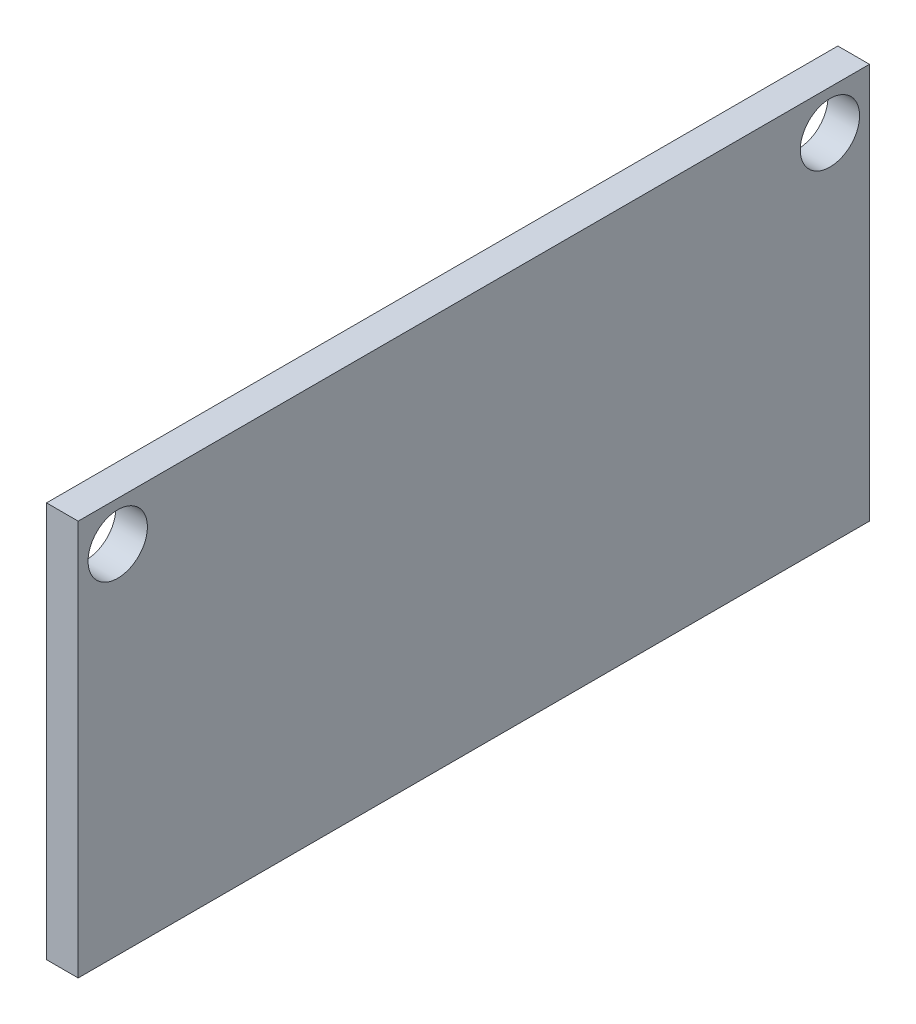
ISO-10303-21;
HEADER;
FILE_DESCRIPTION(('STEP AP214'),'2;1');
FILE_NAME('part.step','',(''),(''),'','','');
FILE_SCHEMA(('AUTOMOTIVE_DESIGN { 1 0 10303 214 1 1 1 1 }'));
ENDSEC;
DATA;
#1=APPLICATION_CONTEXT('core data for automotive mechanical design processes');
#2=APPLICATION_PROTOCOL_DEFINITION('international standard','automotive_design',2000,#1);
#3=PRODUCT_CONTEXT('',#1,'mechanical');
#4=PRODUCT('Part','Part','',(#3));
#5=PRODUCT_RELATED_PRODUCT_CATEGORY('part','',(#4));
#6=PRODUCT_DEFINITION_FORMATION('','',#4);
#7=PRODUCT_DEFINITION_CONTEXT('part definition',#1,'design');
#8=PRODUCT_DEFINITION('design','',#6,#7);
#9=PRODUCT_DEFINITION_SHAPE('','',#8);
#10=(LENGTH_UNIT() NAMED_UNIT(*) SI_UNIT(.MILLI.,.METRE.));
#11=(NAMED_UNIT(*) PLANE_ANGLE_UNIT() SI_UNIT($,.RADIAN.));
#12=(NAMED_UNIT(*) SI_UNIT($,.STERADIAN.) SOLID_ANGLE_UNIT());
#13=UNCERTAINTY_MEASURE_WITH_UNIT(LENGTH_MEASURE(1.E-05),#10,'distance_accuracy_value','');
#14=(GEOMETRIC_REPRESENTATION_CONTEXT(3) GLOBAL_UNCERTAINTY_ASSIGNED_CONTEXT((#13)) GLOBAL_UNIT_ASSIGNED_CONTEXT((#10,
#11,#12)) REPRESENTATION_CONTEXT('',''));
#15=CARTESIAN_POINT('',(0.,0.,0.));
#16=DIRECTION('',(0.,0.,1.));
#17=DIRECTION('',(1.,0.,0.));
#18=AXIS2_PLACEMENT_3D('',#15,#16,#17);
#19=CARTESIAN_POINT('',(1.6,20.,20.));
#20=DIRECTION('',(-1.,0.,0.));
#21=DIRECTION('',(0.,0.,1.));
#22=AXIS2_PLACEMENT_3D('',#19,#20,#21);
#23=PLANE('',#22);
#24=CARTESIAN_POINT('',(1.6,18.,18.));
#25=DIRECTION('',(1.,0.,0.));
#26=DIRECTION('',(0.,0.,-1.));
#27=AXIS2_PLACEMENT_3D('',#24,#25,#26);
#28=CIRCLE('',#27,1.5);
#29=CARTESIAN_POINT('',(1.6,18.,16.5));
#30=VERTEX_POINT('',#29);
#31=EDGE_CURVE('E112',#30,#30,#28,.T.);
#32=ORIENTED_EDGE('',*,*,#31,.F.);
#33=EDGE_LOOP('',(#32));
#34=FACE_BOUND('',#33,.T.);
#35=DIRECTION('',(0.,-1.,0.));
#36=VECTOR('',#35,1.);
#37=CARTESIAN_POINT('',(1.6,0.,20.));
#38=LINE('',#37,#36);
#39=CARTESIAN_POINT('',(1.6,20.,20.));
#40=VERTEX_POINT('',#39);
#41=CARTESIAN_POINT('',(1.6,0.,20.));
#42=VERTEX_POINT('',#41);
#43=EDGE_CURVE('E92',#40,#42,#38,.T.);
#44=ORIENTED_EDGE('',*,*,#43,.T.);
#45=DIRECTION('',(0.,0.,-1.));
#46=VECTOR('',#45,1.);
#47=CARTESIAN_POINT('',(1.6,0.,20.));
#48=LINE('',#47,#46);
#49=CARTESIAN_POINT('',(1.6,0.,-20.));
#50=VERTEX_POINT('',#49);
#51=EDGE_CURVE('E87',#42,#50,#48,.T.);
#52=ORIENTED_EDGE('',*,*,#51,.T.);
#53=DIRECTION('',(0.,1.,0.));
#54=VECTOR('',#53,1.);
#55=CARTESIAN_POINT('',(1.6,0.,-20.));
#56=LINE('',#55,#54);
#57=CARTESIAN_POINT('',(1.6,20.,-20.));
#58=VERTEX_POINT('',#57);
#59=EDGE_CURVE('E90',#50,#58,#56,.T.);
#60=ORIENTED_EDGE('',*,*,#59,.T.);
#61=DIRECTION('',(0.,0.,1.));
#62=VECTOR('',#61,1.);
#63=CARTESIAN_POINT('',(1.6,20.,20.));
#64=LINE('',#63,#62);
#65=EDGE_CURVE('E57',#58,#40,#64,.T.);
#66=ORIENTED_EDGE('',*,*,#65,.T.);
#67=EDGE_LOOP('',(#44,#52,#60,#66));
#68=FACE_BOUND('',#67,.T.);
#69=CARTESIAN_POINT('',(1.6,18.,-18.));
#70=DIRECTION('',(1.,0.,0.));
#71=DIRECTION('',(0.,0.,1.));
#72=AXIS2_PLACEMENT_3D('',#69,#70,#71);
#73=CIRCLE('',#72,1.5);
#74=CARTESIAN_POINT('',(1.6,18.,-16.5));
#75=VERTEX_POINT('',#74);
#76=EDGE_CURVE('E134',#75,#75,#73,.T.);
#77=ORIENTED_EDGE('',*,*,#76,.F.);
#78=EDGE_LOOP('',(#77));
#79=FACE_BOUND('',#78,.T.);
#80=ADVANCED_FACE('F39',(#34,#68,#79),#23,.F.);
#81=CARTESIAN_POINT('',(0.,20.,20.));
#82=DIRECTION('',(-1.,0.,0.));
#83=DIRECTION('',(0.,0.,1.));
#84=AXIS2_PLACEMENT_3D('',#81,#82,#83);
#85=PLANE('',#84);
#86=CARTESIAN_POINT('',(0.,18.,18.));
#87=DIRECTION('',(1.,0.,0.));
#88=DIRECTION('',(0.,0.,-1.));
#89=AXIS2_PLACEMENT_3D('',#86,#87,#88);
#90=CIRCLE('',#89,1.5);
#91=CARTESIAN_POINT('',(0.,18.,16.5));
#92=VERTEX_POINT('',#91);
#93=EDGE_CURVE('E130',#92,#92,#90,.T.);
#94=ORIENTED_EDGE('',*,*,#93,.T.);
#95=EDGE_LOOP('',(#94));
#96=FACE_BOUND('',#95,.T.);
#97=DIRECTION('',(0.,-1.,0.));
#98=VECTOR('',#97,1.);
#99=CARTESIAN_POINT('',(0.,0.,20.));
#100=LINE('',#99,#98);
#101=CARTESIAN_POINT('',(0.,20.,20.));
#102=VERTEX_POINT('',#101);
#103=CARTESIAN_POINT('',(0.,0.,20.));
#104=VERTEX_POINT('',#103);
#105=EDGE_CURVE('E108',#102,#104,#100,.T.);
#106=ORIENTED_EDGE('',*,*,#105,.F.);
#107=DIRECTION('',(0.,0.,1.));
#108=VECTOR('',#107,1.);
#109=CARTESIAN_POINT('',(0.,20.,20.));
#110=LINE('',#109,#108);
#111=CARTESIAN_POINT('',(0.,20.,-20.));
#112=VERTEX_POINT('',#111);
#113=EDGE_CURVE('E80',#112,#102,#110,.T.);
#114=ORIENTED_EDGE('',*,*,#113,.F.);
#115=DIRECTION('',(0.,1.,0.));
#116=VECTOR('',#115,1.);
#117=CARTESIAN_POINT('',(0.,0.,-20.));
#118=LINE('',#117,#116);
#119=CARTESIAN_POINT('',(0.,0.,-20.));
#120=VERTEX_POINT('',#119);
#121=EDGE_CURVE('E74',#120,#112,#118,.T.);
#122=ORIENTED_EDGE('',*,*,#121,.F.);
#123=DIRECTION('',(0.,0.,-1.));
#124=VECTOR('',#123,1.);
#125=CARTESIAN_POINT('',(0.,0.,20.));
#126=LINE('',#125,#124);
#127=EDGE_CURVE('E97',#104,#120,#126,.T.);
#128=ORIENTED_EDGE('',*,*,#127,.F.);
#129=EDGE_LOOP('',(#106,#114,#122,#128));
#130=FACE_BOUND('',#129,.T.);
#131=CARTESIAN_POINT('',(0.,18.,-18.));
#132=DIRECTION('',(1.,0.,0.));
#133=DIRECTION('',(0.,0.,1.));
#134=AXIS2_PLACEMENT_3D('',#131,#132,#133);
#135=CIRCLE('',#134,1.5);
#136=CARTESIAN_POINT('',(0.,18.,-16.5));
#137=VERTEX_POINT('',#136);
#138=EDGE_CURVE('E138',#137,#137,#135,.T.);
#139=ORIENTED_EDGE('',*,*,#138,.T.);
#140=EDGE_LOOP('',(#139));
#141=FACE_BOUND('',#140,.T.);
#142=ADVANCED_FACE('F125',(#96,#130,#141),#85,.T.);
#143=CARTESIAN_POINT('',(1.6,0.,20.));
#144=DIRECTION('',(0.,0.,-1.));
#145=DIRECTION('',(-1.,0.,0.));
#146=AXIS2_PLACEMENT_3D('',#143,#144,#145);
#147=PLANE('',#146);
#148=ORIENTED_EDGE('',*,*,#105,.T.);
#149=DIRECTION('',(-1.,0.,0.));
#150=VECTOR('',#149,1.);
#151=CARTESIAN_POINT('',(1.6,0.,20.));
#152=LINE('',#151,#150);
#153=EDGE_CURVE('E11',#42,#104,#152,.T.);
#154=ORIENTED_EDGE('',*,*,#153,.F.);
#155=ORIENTED_EDGE('',*,*,#43,.F.);
#156=DIRECTION('',(-1.,0.,0.));
#157=VECTOR('',#156,1.);
#158=CARTESIAN_POINT('',(1.6,20.,20.));
#159=LINE('',#158,#157);
#160=EDGE_CURVE('E104',#40,#102,#159,.T.);
#161=ORIENTED_EDGE('',*,*,#160,.T.);
#162=EDGE_LOOP('',(#148,#154,#155,#161));
#163=FACE_BOUND('',#162,.T.);
#164=ADVANCED_FACE('F41',(#163),#147,.F.);
#165=CARTESIAN_POINT('',(1.6,0.,20.));
#166=DIRECTION('',(0.,1.,0.));
#167=DIRECTION('',(0.,0.,1.));
#168=AXIS2_PLACEMENT_3D('',#165,#166,#167);
#169=PLANE('',#168);
#170=ORIENTED_EDGE('',*,*,#127,.T.);
#171=DIRECTION('',(-1.,0.,0.));
#172=VECTOR('',#171,1.);
#173=CARTESIAN_POINT('',(1.6,0.,-20.));
#174=LINE('',#173,#172);
#175=EDGE_CURVE('E49',#50,#120,#174,.T.);
#176=ORIENTED_EDGE('',*,*,#175,.F.);
#177=ORIENTED_EDGE('',*,*,#51,.F.);
#178=ORIENTED_EDGE('',*,*,#153,.T.);
#179=EDGE_LOOP('',(#170,#176,#177,#178));
#180=FACE_BOUND('',#179,.T.);
#181=ADVANCED_FACE('F96',(#180),#169,.F.);
#182=CARTESIAN_POINT('',(1.6,0.,-20.));
#183=DIRECTION('',(0.,0.,1.));
#184=DIRECTION('',(1.,0.,0.));
#185=AXIS2_PLACEMENT_3D('',#182,#183,#184);
#186=PLANE('',#185);
#187=ORIENTED_EDGE('',*,*,#121,.T.);
#188=DIRECTION('',(-1.,0.,0.));
#189=VECTOR('',#188,1.);
#190=CARTESIAN_POINT('',(1.6,20.,-20.));
#191=LINE('',#190,#189);
#192=EDGE_CURVE('E99',#58,#112,#191,.T.);
#193=ORIENTED_EDGE('',*,*,#192,.F.);
#194=ORIENTED_EDGE('',*,*,#59,.F.);
#195=ORIENTED_EDGE('',*,*,#175,.T.);
#196=EDGE_LOOP('',(#187,#193,#194,#195));
#197=FACE_BOUND('',#196,.T.);
#198=ADVANCED_FACE('F100',(#197),#186,.F.);
#199=CARTESIAN_POINT('',(1.6,20.,20.));
#200=DIRECTION('',(0.,-1.,0.));
#201=DIRECTION('',(0.,0.,-1.));
#202=AXIS2_PLACEMENT_3D('',#199,#200,#201);
#203=PLANE('',#202);
#204=ORIENTED_EDGE('',*,*,#113,.T.);
#205=ORIENTED_EDGE('',*,*,#160,.F.);
#206=ORIENTED_EDGE('',*,*,#65,.F.);
#207=ORIENTED_EDGE('',*,*,#192,.T.);
#208=EDGE_LOOP('',(#204,#205,#206,#207));
#209=FACE_BOUND('',#208,.T.);
#210=ADVANCED_FACE('F122',(#209),#203,.F.);
#211=CARTESIAN_POINT('',(1.6,18.,18.));
#212=DIRECTION('',(-1.,0.,0.));
#213=DIRECTION('',(0.,0.,1.));
#214=AXIS2_PLACEMENT_3D('',#211,#212,#213);
#215=CYLINDRICAL_SURFACE('',#214,1.5);
#216=ORIENTED_EDGE('',*,*,#31,.T.);
#217=EDGE_LOOP('',(#216));
#218=FACE_BOUND('',#217,.T.);
#219=ORIENTED_EDGE('',*,*,#93,.F.);
#220=EDGE_LOOP('',(#219));
#221=FACE_BOUND('',#220,.T.);
#222=ADVANCED_FACE('F158',(#218,#221),#215,.F.);
#223=CARTESIAN_POINT('',(1.6,18.,-18.));
#224=DIRECTION('',(-1.,0.,0.));
#225=DIRECTION('',(0.,0.,1.));
#226=AXIS2_PLACEMENT_3D('',#223,#224,#225);
#227=CYLINDRICAL_SURFACE('',#226,1.5);
#228=ORIENTED_EDGE('',*,*,#76,.T.);
#229=EDGE_LOOP('',(#228));
#230=FACE_BOUND('',#229,.T.);
#231=ORIENTED_EDGE('',*,*,#138,.F.);
#232=EDGE_LOOP('',(#231));
#233=FACE_BOUND('',#232,.T.);
#234=ADVANCED_FACE('F146',(#230,#233),#227,.F.);
#235=CLOSED_SHELL('',(#80,#142,#164,#181,#198,#210,#222,#234));
#236=MANIFOLD_SOLID_BREP('B2',#235);
#237=ADVANCED_BREP_SHAPE_REPRESENTATION('',(#18,#236),#14);
#238=SHAPE_DEFINITION_REPRESENTATION(#9,#237);
ENDSEC;
END-ISO-10303-21;
